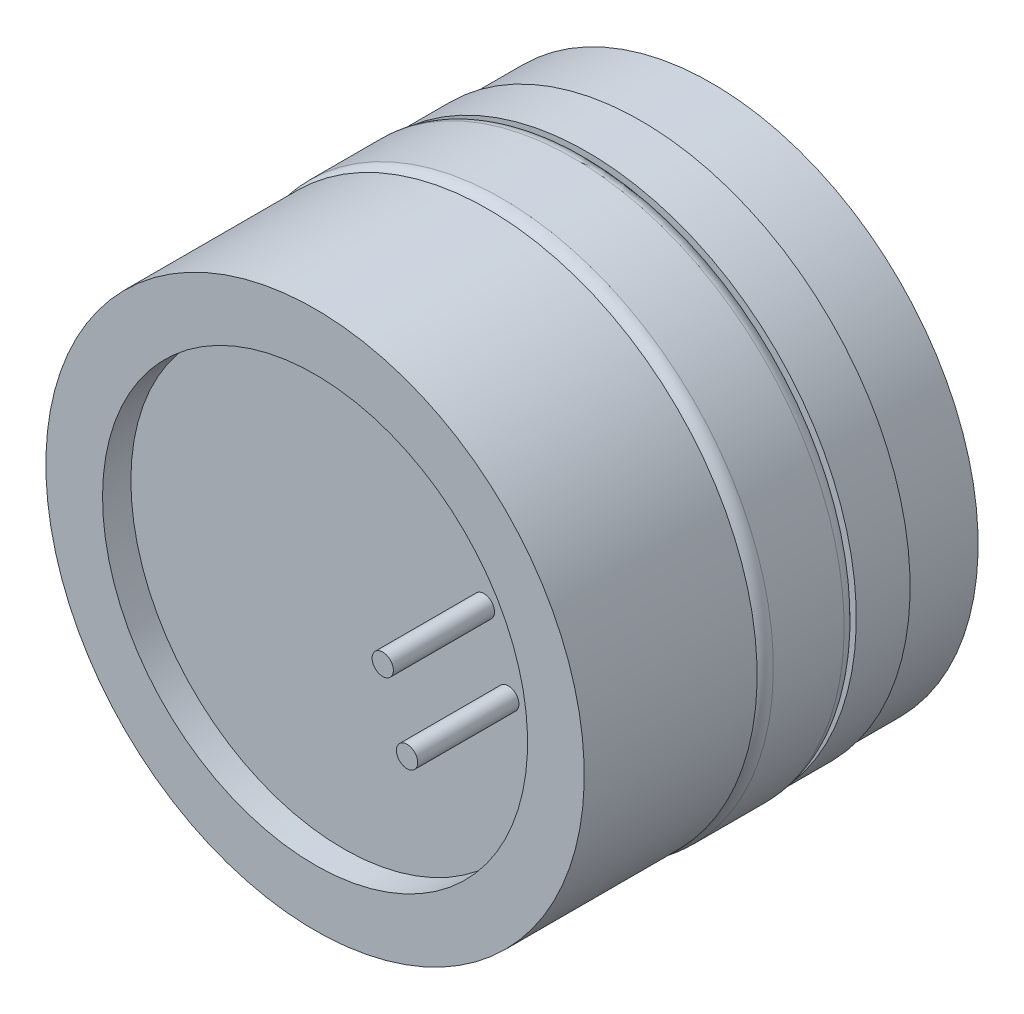
ISO-10303-21;
HEADER;
FILE_DESCRIPTION(('STEP AP214'),'2;1');
FILE_NAME('part.step','',(''),(''),'','','');
FILE_SCHEMA(('AUTOMOTIVE_DESIGN { 1 0 10303 214 1 1 1 1 }'));
ENDSEC;
DATA;
#1=APPLICATION_CONTEXT('core data for automotive mechanical design processes');
#2=APPLICATION_PROTOCOL_DEFINITION('international standard','automotive_design',2000,#1);
#3=PRODUCT_CONTEXT('',#1,'mechanical');
#4=PRODUCT('Part','Part','',(#3));
#5=PRODUCT_RELATED_PRODUCT_CATEGORY('part','',(#4));
#6=PRODUCT_DEFINITION_FORMATION('','',#4);
#7=PRODUCT_DEFINITION_CONTEXT('part definition',#1,'design');
#8=PRODUCT_DEFINITION('design','',#6,#7);
#9=PRODUCT_DEFINITION_SHAPE('','',#8);
#10=(LENGTH_UNIT() NAMED_UNIT(*) SI_UNIT(.MILLI.,.METRE.));
#11=(NAMED_UNIT(*) PLANE_ANGLE_UNIT() SI_UNIT($,.RADIAN.));
#12=(NAMED_UNIT(*) SI_UNIT($,.STERADIAN.) SOLID_ANGLE_UNIT());
#13=UNCERTAINTY_MEASURE_WITH_UNIT(LENGTH_MEASURE(1.E-05),#10,'distance_accuracy_value','');
#14=(GEOMETRIC_REPRESENTATION_CONTEXT(3) GLOBAL_UNCERTAINTY_ASSIGNED_CONTEXT((#13)) GLOBAL_UNIT_ASSIGNED_CONTEXT((#10,
#11,#12)) REPRESENTATION_CONTEXT('',''));
#15=CARTESIAN_POINT('',(0.,0.,0.));
#16=DIRECTION('',(0.,0.,1.));
#17=DIRECTION('',(1.,0.,0.));
#18=AXIS2_PLACEMENT_3D('',#15,#16,#17);
#19=CARTESIAN_POINT('',(4.95929305313776,2.4037530576372,11.57143804));
#20=DIRECTION('',(0.,0.,0.999999999999999));
#21=DIRECTION('',(0.,-1.,0.));
#22=AXIS2_PLACEMENT_3D('',#19,#20,#21);
#23=CYLINDRICAL_SURFACE('',#22,0.375);
#24=CARTESIAN_POINT('',(4.95929305313776,2.4037530576372,11.57143804));
#25=DIRECTION('',(0.,0.,0.999999999999999));
#26=DIRECTION('',(0.,-1.,0.));
#27=AXIS2_PLACEMENT_3D('',#24,#25,#26);
#28=CIRCLE('',#27,0.375);
#29=CARTESIAN_POINT('',(4.95929305313776,2.0287530576372,11.57143804));
#30=VERTEX_POINT('',#29);
#31=EDGE_CURVE('E12',#30,#30,#28,.T.);
#32=ORIENTED_EDGE('',*,*,#31,.T.);
#33=EDGE_LOOP('',(#32));
#34=FACE_BOUND('',#33,.T.);
#35=CARTESIAN_POINT('',(4.95929305313776,2.4037530576372,16.57143804));
#36=DIRECTION('',(0.,0.,0.999999999999999));
#37=DIRECTION('',(1.,0.,0.));
#38=AXIS2_PLACEMENT_3D('',#35,#36,#37);
#39=CIRCLE('',#38,0.375);
#40=CARTESIAN_POINT('',(5.33429305313776,2.4037530576372,16.57143804));
#41=VERTEX_POINT('',#40);
#42=EDGE_CURVE('E56',#41,#41,#39,.F.);
#43=ORIENTED_EDGE('',*,*,#42,.T.);
#44=EDGE_LOOP('',(#43));
#45=FACE_BOUND('',#44,.T.);
#46=ADVANCED_FACE('F53',(#34,#45),#23,.T.);
#47=CARTESIAN_POINT('',(0.,0.,11.57143804));
#48=DIRECTION('',(0.,0.,0.999999999999999));
#49=DIRECTION('',(1.,0.,0.));
#50=AXIS2_PLACEMENT_3D('',#47,#48,#49);
#51=PLANE('',#50);
#52=ORIENTED_EDGE('',*,*,#31,.F.);
#53=EDGE_LOOP('',(#52));
#54=FACE_BOUND('',#53,.T.);
#55=ADVANCED_FACE('F64',(#54),#51,.F.);
#56=CARTESIAN_POINT('',(5.36771313615573,1.45833607492907,16.57143804));
#57=DIRECTION('',(0.,0.,0.999999999999999));
#58=DIRECTION('',(1.,0.,0.));
#59=AXIS2_PLACEMENT_3D('',#56,#57,#58);
#60=PLANE('',#59);
#61=ORIENTED_EDGE('',*,*,#42,.F.);
#62=EDGE_LOOP('',(#61));
#63=FACE_BOUND('',#62,.T.);
#64=ADVANCED_FACE('F66',(#63),#60,.T.);
#65=CLOSED_SHELL('',(#46,#55,#64));
#66=MANIFOLD_SOLID_BREP('B2',#65);
#67=CARTESIAN_POINT('',(5.81826745192966,0.0134051787249867,11.57143804));
#68=DIRECTION('',(0.,0.,0.999999999999999));
#69=DIRECTION('',(0.,-1.,0.));
#70=AXIS2_PLACEMENT_3D('',#67,#68,#69);
#71=CYLINDRICAL_SURFACE('',#70,0.375);
#72=CARTESIAN_POINT('',(5.81826745192966,0.0134051787249867,11.57143804));
#73=DIRECTION('',(0.,0.,0.999999999999999));
#74=DIRECTION('',(0.,-1.,0.));
#75=AXIS2_PLACEMENT_3D('',#72,#73,#74);
#76=CIRCLE('',#75,0.375);
#77=CARTESIAN_POINT('',(5.81826745192966,-0.361594821275014,11.57143804));
#78=VERTEX_POINT('',#77);
#79=EDGE_CURVE('E51',#78,#78,#76,.T.);
#80=ORIENTED_EDGE('',*,*,#79,.T.);
#81=EDGE_LOOP('',(#80));
#82=FACE_BOUND('',#81,.T.);
#83=CARTESIAN_POINT('',(5.81826745192966,0.0134051787249863,16.57143804));
#84=DIRECTION('',(0.,0.,0.999999999999999));
#85=DIRECTION('',(1.,0.,0.));
#86=AXIS2_PLACEMENT_3D('',#83,#84,#85);
#87=CIRCLE('',#86,0.375);
#88=CARTESIAN_POINT('',(6.19326745192966,0.0134051787249863,16.57143804));
#89=VERTEX_POINT('',#88);
#90=EDGE_CURVE('E107',#89,#89,#87,.F.);
#91=ORIENTED_EDGE('',*,*,#90,.T.);
#92=EDGE_LOOP('',(#91));
#93=FACE_BOUND('',#92,.T.);
#94=ADVANCED_FACE('F103',(#82,#93),#71,.T.);
#95=CARTESIAN_POINT('',(0.,0.,11.57143804));
#96=DIRECTION('',(0.,0.,0.999999999999999));
#97=DIRECTION('',(1.,0.,0.));
#98=AXIS2_PLACEMENT_3D('',#95,#96,#97);
#99=PLANE('',#98);
#100=ORIENTED_EDGE('',*,*,#79,.F.);
#101=EDGE_LOOP('',(#100));
#102=FACE_BOUND('',#101,.T.);
#103=ADVANCED_FACE('F105',(#102),#99,.F.);
#104=CARTESIAN_POINT('',(5.36771313615573,1.45833607492907,16.57143804));
#105=DIRECTION('',(0.,0.,0.999999999999999));
#106=DIRECTION('',(1.,0.,0.));
#107=AXIS2_PLACEMENT_3D('',#104,#105,#106);
#108=PLANE('',#107);
#109=ORIENTED_EDGE('',*,*,#90,.F.);
#110=EDGE_LOOP('',(#109));
#111=FACE_BOUND('',#110,.T.);
#112=ADVANCED_FACE('F116',(#111),#108,.T.);
#113=CLOSED_SHELL('',(#94,#103,#112));
#114=MANIFOLD_SOLID_BREP('B6',#113);
#115=CARTESIAN_POINT('',(0.,0.,7.39609619231285));
#116=DIRECTION('',(0.,0.,-0.999999999999999));
#117=DIRECTION('',(0.703583112733695,0.710612977278043,0.));
#118=AXIS2_PLACEMENT_3D('',#115,#116,#117);
#119=TOROIDAL_SURFACE('',#118,9.07041416058447,0.5);
#120=CARTESIAN_POINT('',(0.,0.,7.39609619231285));
#121=DIRECTION('',(0.,0.,-0.999999999999999));
#122=DIRECTION('',(0.703583112733695,0.710612977278043,0.));
#123=AXIS2_PLACEMENT_3D('',#120,#121,#122);
#124=CIRCLE('',#123,9.57041416058447);
#125=CARTESIAN_POINT('',(6.73358178525466,6.80086050043688,7.39609619231285));
#126=VERTEX_POINT('',#125);
#127=EDGE_CURVE('E162',#126,#126,#124,.T.);
#128=ORIENTED_EDGE('',*,*,#127,.F.);
#129=EDGE_LOOP('',(#128));
#130=FACE_BOUND('',#129,.T.);
#131=CARTESIAN_POINT('',(0.,0.,7.89609619231285));
#132=DIRECTION('',(0.,0.,-0.999999999999999));
#133=DIRECTION('',(0.703583112733695,0.710612977278043,0.));
#134=AXIS2_PLACEMENT_3D('',#131,#132,#133);
#135=CIRCLE('',#134,9.07041416058447);
#136=CARTESIAN_POINT('',(6.38179022888781,6.44555401179785,7.89609619231285));
#137=VERTEX_POINT('',#136);
#138=EDGE_CURVE('E101',#137,#137,#135,.T.);
#139=ORIENTED_EDGE('',*,*,#138,.T.);
#140=EDGE_LOOP('',(#139));
#141=FACE_BOUND('',#140,.T.);
#142=ADVANCED_FACE('F152',(#130,#141),#119,.T.);
#143=CARTESIAN_POINT('',(0.,0.,7.89609619231285));
#144=DIRECTION('',(0.,0.,0.999999999999999));
#145=DIRECTION('',(1.,0.,0.));
#146=AXIS2_PLACEMENT_3D('',#143,#144,#145);
#147=PLANE('',#146);
#148=CARTESIAN_POINT('',(0.,0.,7.89609619231285));
#149=DIRECTION('',(0.,0.,-0.999999999999999));
#150=DIRECTION('',(0.703583112733695,0.710612977278043,0.));
#151=AXIS2_PLACEMENT_3D('',#148,#149,#150);
#152=CIRCLE('',#151,9.01057563211806);
#153=CARTESIAN_POINT('',(6.33968885076801,6.4030319769284,7.89609619231285));
#154=VERTEX_POINT('',#153);
#155=EDGE_CURVE('E196',#154,#154,#152,.T.);
#156=ORIENTED_EDGE('',*,*,#155,.T.);
#157=EDGE_LOOP('',(#156));
#158=FACE_BOUND('',#157,.T.);
#159=ORIENTED_EDGE('',*,*,#138,.F.);
#160=EDGE_LOOP('',(#159));
#161=FACE_BOUND('',#160,.T.);
#162=ADVANCED_FACE('F209',(#158,#161),#147,.T.);
#163=CARTESIAN_POINT('',(0.,0.,7.39609619231285));
#164=DIRECTION('',(0.,0.,-0.999999999999999));
#165=DIRECTION('',(0.703583112733695,0.710612977278043,0.));
#166=AXIS2_PLACEMENT_3D('',#163,#164,#165);
#167=CYLINDRICAL_SURFACE('',#166,9.57041416058447);
#168=ORIENTED_EDGE('',*,*,#127,.T.);
#169=EDGE_LOOP('',(#168));
#170=FACE_BOUND('',#169,.T.);
#171=CARTESIAN_POINT('',(0.,0.,4.9));
#172=DIRECTION('',(0.,0.,-0.999999999999999));
#173=DIRECTION('',(0.703583112733695,0.710612977278043,0.));
#174=AXIS2_PLACEMENT_3D('',#171,#172,#173);
#175=CIRCLE('',#174,9.57041416058447);
#176=CARTESIAN_POINT('',(6.73358178525466,6.80086050043688,4.9));
#177=VERTEX_POINT('',#176);
#178=EDGE_CURVE('E156',#177,#177,#175,.T.);
#179=ORIENTED_EDGE('',*,*,#178,.F.);
#180=EDGE_LOOP('',(#179));
#181=FACE_BOUND('',#180,.T.);
#182=ADVANCED_FACE('F206',(#170,#181),#167,.T.);
#183=CARTESIAN_POINT('',(0.,0.,7.39609619231285));
#184=DIRECTION('',(0.,0.,-0.999999999999999));
#185=DIRECTION('',(0.703583112733695,0.710612977278043,0.));
#186=AXIS2_PLACEMENT_3D('',#183,#184,#185);
#187=TOROIDAL_SURFACE('',#186,9.01057563211806,0.5);
#188=ORIENTED_EDGE('',*,*,#155,.F.);
#189=EDGE_LOOP('',(#188));
#190=FACE_BOUND('',#189,.T.);
#191=CARTESIAN_POINT('',(0.,0.,7.39609619231285));
#192=DIRECTION('',(0.,0.,-0.999999999999999));
#193=DIRECTION('',(0.703583112733695,0.710612977278043,0.));
#194=AXIS2_PLACEMENT_3D('',#191,#192,#193);
#195=CIRCLE('',#194,8.51057563211806);
#196=CARTESIAN_POINT('',(5.98789729440116,6.04772548828938,7.39609619231285));
#197=VERTEX_POINT('',#196);
#198=EDGE_CURVE('E190',#197,#197,#195,.T.);
#199=ORIENTED_EDGE('',*,*,#198,.T.);
#200=EDGE_LOOP('',(#199));
#201=FACE_BOUND('',#200,.T.);
#202=ADVANCED_FACE('F208',(#190,#201),#187,.T.);
#203=CARTESIAN_POINT('',(0.,0.,4.9));
#204=DIRECTION('',(0.,0.,-0.999999999999999));
#205=DIRECTION('',(0.703583112733695,0.710612977278043,0.));
#206=AXIS2_PLACEMENT_3D('',#203,#204,#205);
#207=TOROIDAL_SURFACE('',#206,9.07041416058447,0.5);
#208=ORIENTED_EDGE('',*,*,#178,.T.);
#209=EDGE_LOOP('',(#208));
#210=FACE_BOUND('',#209,.T.);
#211=CARTESIAN_POINT('',(0.,0.,4.4));
#212=DIRECTION('',(0.,0.,-0.999999999999999));
#213=DIRECTION('',(0.703583112733695,0.710612977278043,0.));
#214=AXIS2_PLACEMENT_3D('',#211,#212,#213);
#215=CIRCLE('',#214,9.07041416058447);
#216=CARTESIAN_POINT('',(6.38179022888781,6.44555401179785,4.4));
#217=VERTEX_POINT('',#216);
#218=EDGE_CURVE('E188',#217,#217,#215,.T.);
#219=ORIENTED_EDGE('',*,*,#218,.F.);
#220=EDGE_LOOP('',(#219));
#221=FACE_BOUND('',#220,.T.);
#222=ADVANCED_FACE('F204',(#210,#221),#207,.T.);
#223=CARTESIAN_POINT('',(0.,0.,4.9));
#224=DIRECTION('',(0.,0.,-0.999999999999999));
#225=DIRECTION('',(0.703583112733695,0.710612977278043,0.));
#226=AXIS2_PLACEMENT_3D('',#223,#224,#225);
#227=CYLINDRICAL_SURFACE('',#226,8.51057563211806);
#228=ORIENTED_EDGE('',*,*,#198,.F.);
#229=EDGE_LOOP('',(#228));
#230=FACE_BOUND('',#229,.T.);
#231=CARTESIAN_POINT('',(0.,0.,4.9));
#232=DIRECTION('',(0.,0.,-0.999999999999999));
#233=DIRECTION('',(0.703583112733695,0.710612977278043,0.));
#234=AXIS2_PLACEMENT_3D('',#231,#232,#233);
#235=CIRCLE('',#234,8.51057563211806);
#236=CARTESIAN_POINT('',(5.98789729440116,6.04772548828938,4.9));
#237=VERTEX_POINT('',#236);
#238=EDGE_CURVE('E193',#237,#237,#235,.T.);
#239=ORIENTED_EDGE('',*,*,#238,.T.);
#240=EDGE_LOOP('',(#239));
#241=FACE_BOUND('',#240,.T.);
#242=ADVANCED_FACE('F226',(#230,#241),#227,.F.);
#243=CARTESIAN_POINT('',(0.,0.,4.4));
#244=DIRECTION('',(0.,0.,-0.999999999999999));
#245=DIRECTION('',(-1.,0.,0.));
#246=AXIS2_PLACEMENT_3D('',#243,#244,#245);
#247=PLANE('',#246);
#248=CARTESIAN_POINT('',(0.,0.,4.4));
#249=DIRECTION('',(0.,0.,-0.999999999999999));
#250=DIRECTION('',(0.703583112733695,0.710612977278043,0.));
#251=AXIS2_PLACEMENT_3D('',#248,#249,#250);
#252=CIRCLE('',#251,9.01057563211806);
#253=CARTESIAN_POINT('',(6.33968885076801,6.4030319769284,4.4));
#254=VERTEX_POINT('',#253);
#255=EDGE_CURVE('E184',#254,#254,#252,.T.);
#256=ORIENTED_EDGE('',*,*,#255,.F.);
#257=EDGE_LOOP('',(#256));
#258=FACE_BOUND('',#257,.T.);
#259=ORIENTED_EDGE('',*,*,#218,.T.);
#260=EDGE_LOOP('',(#259));
#261=FACE_BOUND('',#260,.T.);
#262=ADVANCED_FACE('F154',(#258,#261),#247,.T.);
#263=CARTESIAN_POINT('',(0.,0.,4.9));
#264=DIRECTION('',(0.,0.,-0.999999999999999));
#265=DIRECTION('',(0.703583112733695,0.710612977278043,0.));
#266=AXIS2_PLACEMENT_3D('',#263,#264,#265);
#267=TOROIDAL_SURFACE('',#266,9.01057563211806,0.5);
#268=ORIENTED_EDGE('',*,*,#255,.T.);
#269=EDGE_LOOP('',(#268));
#270=FACE_BOUND('',#269,.T.);
#271=ORIENTED_EDGE('',*,*,#238,.F.);
#272=EDGE_LOOP('',(#271));
#273=FACE_BOUND('',#272,.T.);
#274=ADVANCED_FACE('F235',(#270,#273),#267,.T.);
#275=CLOSED_SHELL('',(#142,#162,#182,#202,#222,#242,#262,#274));
#276=MANIFOLD_SOLID_BREP('B45',#275);
#277=CARTESIAN_POINT('',(0.,0.,0.199999999999999));
#278=DIRECTION('',(0.,0.,-0.999999999999999));
#279=DIRECTION('',(-1.,0.,0.));
#280=AXIS2_PLACEMENT_3D('',#277,#278,#279);
#281=PLANE('',#280);
#282=CARTESIAN_POINT('',(0.,0.,0.199999999999999));
#283=DIRECTION('',(0.,0.,-0.999999999999999));
#284=DIRECTION('',(0.703583112733695,0.710612977278043,0.));
#285=AXIS2_PLACEMENT_3D('',#282,#283,#284);
#286=CIRCLE('',#285,8.3);
#287=CARTESIAN_POINT('',(5.83973983568967,5.89808771140776,0.199999999999999));
#288=VERTEX_POINT('',#287);
#289=EDGE_CURVE('E150',#288,#288,#286,.T.);
#290=ORIENTED_EDGE('',*,*,#289,.T.);
#291=EDGE_LOOP('',(#290));
#292=FACE_BOUND('',#291,.T.);
#293=ADVANCED_FACE('F271',(#292),#281,.T.);
#294=CARTESIAN_POINT('',(0.,0.,0.));
#295=DIRECTION('',(0.,0.,-0.999999999999999));
#296=DIRECTION('',(0.703583112733695,0.710612977278043,0.));
#297=AXIS2_PLACEMENT_3D('',#294,#295,#296);
#298=CYLINDRICAL_SURFACE('',#297,8.3);
#299=CARTESIAN_POINT('',(0.,0.,0.));
#300=DIRECTION('',(0.,0.,-0.999999999999999));
#301=DIRECTION('',(0.703583112733695,0.710612977278043,0.));
#302=AXIS2_PLACEMENT_3D('',#299,#300,#301);
#303=CIRCLE('',#302,8.3);
#304=CARTESIAN_POINT('',(5.83973983568967,5.89808771140776,0.));
#305=VERTEX_POINT('',#304);
#306=EDGE_CURVE('E281',#305,#305,#303,.T.);
#307=ORIENTED_EDGE('',*,*,#306,.T.);
#308=EDGE_LOOP('',(#307));
#309=FACE_BOUND('',#308,.T.);
#310=ORIENTED_EDGE('',*,*,#289,.F.);
#311=EDGE_LOOP('',(#310));
#312=FACE_BOUND('',#311,.T.);
#313=ADVANCED_FACE('F366',(#309,#312),#298,.F.);
#314=CARTESIAN_POINT('',(0.,0.,0.));
#315=DIRECTION('',(0.,0.,-0.999999999999999));
#316=DIRECTION('',(-1.,0.,0.));
#317=AXIS2_PLACEMENT_3D('',#314,#315,#316);
#318=PLANE('',#317);
#319=CARTESIAN_POINT('',(0.,0.,0.));
#320=DIRECTION('',(0.,0.,-0.999999999999999));
#321=DIRECTION('',(0.703583112733695,0.710612977278043,0.));
#322=AXIS2_PLACEMENT_3D('',#319,#320,#321);
#323=CIRCLE('',#322,9.4);
#324=CARTESIAN_POINT('',(6.61368125969673,6.67976198641361,0.));
#325=VERTEX_POINT('',#324);
#326=EDGE_CURVE('E320',#325,#325,#323,.T.);
#327=ORIENTED_EDGE('',*,*,#326,.T.);
#328=EDGE_LOOP('',(#327));
#329=FACE_BOUND('',#328,.T.);
#330=ORIENTED_EDGE('',*,*,#306,.F.);
#331=EDGE_LOOP('',(#330));
#332=FACE_BOUND('',#331,.T.);
#333=ADVANCED_FACE('F362',(#329,#332),#318,.T.);
#334=CARTESIAN_POINT('',(0.,0.,2.5));
#335=DIRECTION('',(0.,0.,-0.999999999999999));
#336=DIRECTION('',(0.703583112733695,0.710612977278043,0.));
#337=AXIS2_PLACEMENT_3D('',#334,#335,#336);
#338=CYLINDRICAL_SURFACE('',#337,9.4);
#339=ORIENTED_EDGE('',*,*,#326,.F.);
#340=EDGE_LOOP('',(#339));
#341=FACE_BOUND('',#340,.T.);
#342=CARTESIAN_POINT('',(0.,0.,2.5));
#343=DIRECTION('',(0.,0.,-0.999999999999999));
#344=DIRECTION('',(0.703583112733695,0.710612977278043,0.));
#345=AXIS2_PLACEMENT_3D('',#342,#343,#344);
#346=CIRCLE('',#345,9.4);
#347=CARTESIAN_POINT('',(6.61368125969674,6.67976198641361,2.5));
#348=VERTEX_POINT('',#347);
#349=EDGE_CURVE('E315',#348,#348,#346,.T.);
#350=ORIENTED_EDGE('',*,*,#349,.T.);
#351=EDGE_LOOP('',(#350));
#352=FACE_BOUND('',#351,.T.);
#353=ADVANCED_FACE('F354',(#341,#352),#338,.T.);
#354=CARTESIAN_POINT('',(0.,0.,2.5));
#355=DIRECTION('',(0.,0.,-0.999999999999999));
#356=DIRECTION('',(-1.,0.,0.));
#357=AXIS2_PLACEMENT_3D('',#354,#355,#356);
#358=PLANE('',#357);
#359=CARTESIAN_POINT('',(0.,0.,2.5));
#360=DIRECTION('',(0.,0.,-0.999999999999999));
#361=DIRECTION('',(0.703583112733695,0.710612977278043,0.));
#362=AXIS2_PLACEMENT_3D('',#359,#360,#361);
#363=CIRCLE('',#362,9.5);
#364=CARTESIAN_POINT('',(6.6840395709701,6.75082328414141,2.5));
#365=VERTEX_POINT('',#364);
#366=EDGE_CURVE('E311',#365,#365,#363,.T.);
#367=ORIENTED_EDGE('',*,*,#366,.T.);
#368=EDGE_LOOP('',(#367));
#369=FACE_BOUND('',#368,.T.);
#370=ORIENTED_EDGE('',*,*,#349,.F.);
#371=EDGE_LOOP('',(#370));
#372=FACE_BOUND('',#371,.T.);
#373=ADVANCED_FACE('F351',(#369,#372),#358,.T.);
#374=CARTESIAN_POINT('',(0.,0.,4.4));
#375=DIRECTION('',(0.,0.,-0.999999999999999));
#376=DIRECTION('',(0.703583112733695,0.710612977278043,0.));
#377=AXIS2_PLACEMENT_3D('',#374,#375,#376);
#378=CYLINDRICAL_SURFACE('',#377,9.5);
#379=ORIENTED_EDGE('',*,*,#366,.F.);
#380=EDGE_LOOP('',(#379));
#381=FACE_BOUND('',#380,.T.);
#382=CARTESIAN_POINT('',(0.,0.,4.4));
#383=DIRECTION('',(0.,0.,-0.999999999999999));
#384=DIRECTION('',(0.703583112733695,0.710612977278043,0.));
#385=AXIS2_PLACEMENT_3D('',#382,#383,#384);
#386=CIRCLE('',#385,9.5);
#387=CARTESIAN_POINT('',(6.68403957097014,6.75082328414145,4.4));
#388=VERTEX_POINT('',#387);
#389=EDGE_CURVE('E343',#388,#388,#386,.T.);
#390=ORIENTED_EDGE('',*,*,#389,.T.);
#391=EDGE_LOOP('',(#390));
#392=FACE_BOUND('',#391,.T.);
#393=ADVANCED_FACE('F353',(#381,#392),#378,.T.);
#394=CARTESIAN_POINT('',(0.,0.,4.4));
#395=DIRECTION('',(0.,0.,0.999999999999999));
#396=DIRECTION('',(1.,0.,0.));
#397=AXIS2_PLACEMENT_3D('',#394,#395,#396);
#398=PLANE('',#397);
#399=ORIENTED_EDGE('',*,*,#389,.F.);
#400=EDGE_LOOP('',(#399));
#401=FACE_BOUND('',#400,.T.);
#402=CARTESIAN_POINT('',(0.,0.,4.4));
#403=DIRECTION('',(0.,0.,-0.999999999999999));
#404=DIRECTION('',(0.703583112733695,0.710612977278043,0.));
#405=AXIS2_PLACEMENT_3D('',#402,#403,#404);
#406=CIRCLE('',#405,8.5);
#407=CARTESIAN_POINT('',(5.98045645823645,6.0402103068634,4.4));
#408=VERTEX_POINT('',#407);
#409=EDGE_CURVE('E332',#408,#408,#406,.T.);
#410=ORIENTED_EDGE('',*,*,#409,.T.);
#411=EDGE_LOOP('',(#410));
#412=FACE_BOUND('',#411,.T.);
#413=ADVANCED_FACE('F360',(#401,#412),#398,.T.);
#414=CARTESIAN_POINT('',(0.,0.,7.9));
#415=DIRECTION('',(0.,0.,-0.999999999999999));
#416=DIRECTION('',(0.703583112733695,0.710612977278043,0.));
#417=AXIS2_PLACEMENT_3D('',#414,#415,#416);
#418=CYLINDRICAL_SURFACE('',#417,8.5);
#419=ORIENTED_EDGE('',*,*,#409,.F.);
#420=EDGE_LOOP('',(#419));
#421=FACE_BOUND('',#420,.T.);
#422=CARTESIAN_POINT('',(0.,0.,7.9));
#423=DIRECTION('',(0.,0.,-0.999999999999999));
#424=DIRECTION('',(0.703583112733695,0.710612977278043,0.));
#425=AXIS2_PLACEMENT_3D('',#422,#423,#424);
#426=CIRCLE('',#425,8.5);
#427=CARTESIAN_POINT('',(5.98045645823644,6.0402103068634,7.9));
#428=VERTEX_POINT('',#427);
#429=EDGE_CURVE('E275',#428,#428,#426,.T.);
#430=ORIENTED_EDGE('',*,*,#429,.T.);
#431=EDGE_LOOP('',(#430));
#432=FACE_BOUND('',#431,.T.);
#433=ADVANCED_FACE('F382',(#421,#432),#418,.T.);
#434=CARTESIAN_POINT('',(0.,0.,7.9));
#435=DIRECTION('',(0.,0.,-0.999999999999999));
#436=DIRECTION('',(-1.,0.,0.));
#437=AXIS2_PLACEMENT_3D('',#434,#435,#436);
#438=PLANE('',#437);
#439=CARTESIAN_POINT('',(0.,0.,7.9));
#440=DIRECTION('',(0.,0.,-0.999999999999999));
#441=DIRECTION('',(0.703583112733695,0.710612977278043,0.));
#442=AXIS2_PLACEMENT_3D('',#439,#440,#441);
#443=CIRCLE('',#442,9.5);
#444=CARTESIAN_POINT('',(6.68403957097014,6.75082328414145,7.9));
#445=VERTEX_POINT('',#444);
#446=EDGE_CURVE('E325',#445,#445,#443,.T.);
#447=ORIENTED_EDGE('',*,*,#446,.T.);
#448=EDGE_LOOP('',(#447));
#449=FACE_BOUND('',#448,.T.);
#450=ORIENTED_EDGE('',*,*,#429,.F.);
#451=EDGE_LOOP('',(#450));
#452=FACE_BOUND('',#451,.T.);
#453=ADVANCED_FACE('F387',(#449,#452),#438,.T.);
#454=CARTESIAN_POINT('',(0.,0.,14.));
#455=DIRECTION('',(0.,0.,-0.999999999999999));
#456=DIRECTION('',(0.703583112733695,0.710612977278043,0.));
#457=AXIS2_PLACEMENT_3D('',#454,#455,#456);
#458=CYLINDRICAL_SURFACE('',#457,9.5);
#459=ORIENTED_EDGE('',*,*,#446,.F.);
#460=EDGE_LOOP('',(#459));
#461=FACE_BOUND('',#460,.T.);
#462=CARTESIAN_POINT('',(0.,0.,14.));
#463=DIRECTION('',(0.,0.,-0.999999999999999));
#464=DIRECTION('',(0.703583112733695,0.710612977278043,0.));
#465=AXIS2_PLACEMENT_3D('',#462,#463,#464);
#466=CIRCLE('',#465,9.5);
#467=CARTESIAN_POINT('',(6.68403957097014,6.75082328414145,14.));
#468=VERTEX_POINT('',#467);
#469=EDGE_CURVE('E329',#468,#468,#466,.T.);
#470=ORIENTED_EDGE('',*,*,#469,.T.);
#471=EDGE_LOOP('',(#470));
#472=FACE_BOUND('',#471,.T.);
#473=ADVANCED_FACE('F326',(#461,#472),#458,.T.);
#474=CARTESIAN_POINT('',(0.,0.,14.));
#475=DIRECTION('',(0.,0.,0.999999999999999));
#476=DIRECTION('',(1.,0.,0.));
#477=AXIS2_PLACEMENT_3D('',#474,#475,#476);
#478=PLANE('',#477);
#479=ORIENTED_EDGE('',*,*,#469,.F.);
#480=EDGE_LOOP('',(#479));
#481=FACE_BOUND('',#480,.T.);
#482=CARTESIAN_POINT('',(0.,0.,14.));
#483=DIRECTION('',(0.,0.,-0.999999999999999));
#484=DIRECTION('',(0.703583112733695,0.710612977278043,0.));
#485=AXIS2_PLACEMENT_3D('',#482,#483,#484);
#486=CIRCLE('',#485,7.5);
#487=CARTESIAN_POINT('',(5.27687334550272,5.32959732958532,14.));
#488=VERTEX_POINT('',#487);
#489=EDGE_CURVE('E334',#488,#488,#486,.T.);
#490=ORIENTED_EDGE('',*,*,#489,.T.);
#491=EDGE_LOOP('',(#490));
#492=FACE_BOUND('',#491,.T.);
#493=ADVANCED_FACE('F399',(#481,#492),#478,.T.);
#494=CARTESIAN_POINT('',(0.,0.,13.));
#495=DIRECTION('',(0.,0.,-0.999999999999999));
#496=DIRECTION('',(0.703583112733695,0.710612977278043,0.));
#497=AXIS2_PLACEMENT_3D('',#494,#495,#496);
#498=CYLINDRICAL_SURFACE('',#497,7.5);
#499=CARTESIAN_POINT('',(0.,0.,13.));
#500=DIRECTION('',(0.,0.,-0.999999999999999));
#501=DIRECTION('',(0.703583112733695,0.710612977278043,0.));
#502=AXIS2_PLACEMENT_3D('',#499,#500,#501);
#503=CIRCLE('',#502,7.5);
#504=CARTESIAN_POINT('',(5.27687334550272,5.32959732958532,13.));
#505=VERTEX_POINT('',#504);
#506=EDGE_CURVE('E338',#505,#505,#503,.T.);
#507=ORIENTED_EDGE('',*,*,#506,.T.);
#508=EDGE_LOOP('',(#507));
#509=FACE_BOUND('',#508,.T.);
#510=ORIENTED_EDGE('',*,*,#489,.F.);
#511=EDGE_LOOP('',(#510));
#512=FACE_BOUND('',#511,.T.);
#513=ADVANCED_FACE('F273',(#509,#512),#498,.F.);
#514=CARTESIAN_POINT('',(0.,0.,13.));
#515=DIRECTION('',(0.,0.,0.999999999999999));
#516=DIRECTION('',(1.,0.,0.));
#517=AXIS2_PLACEMENT_3D('',#514,#515,#516);
#518=PLANE('',#517);
#519=ORIENTED_EDGE('',*,*,#506,.F.);
#520=EDGE_LOOP('',(#519));
#521=FACE_BOUND('',#520,.T.);
#522=ADVANCED_FACE('F377',(#521),#518,.T.);
#523=CLOSED_SHELL('',(#293,#313,#333,#353,#373,#393,#413,#433,#453,#473,#493,#513,#522));
#524=MANIFOLD_SOLID_BREP('B95',#523);
#525=ADVANCED_BREP_SHAPE_REPRESENTATION('',(#18,#66,#114,#276,#524),#14);
#526=SHAPE_DEFINITION_REPRESENTATION(#9,#525);
ENDSEC;
END-ISO-10303-21;
